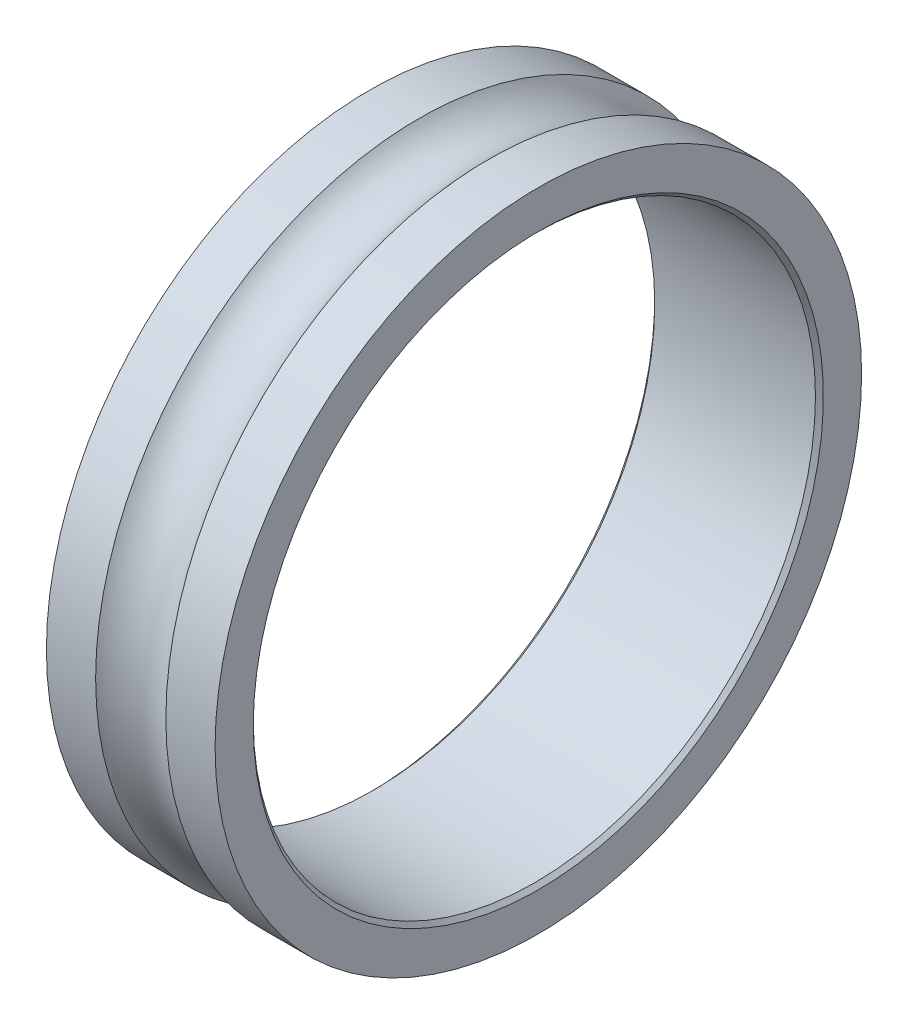
ISO-10303-21;
HEADER;
FILE_DESCRIPTION(('STEP AP214'),'2;1');
FILE_NAME('part.step','',(''),(''),'','','');
FILE_SCHEMA(('AUTOMOTIVE_DESIGN { 1 0 10303 214 1 1 1 1 }'));
ENDSEC;
DATA;
#1=APPLICATION_CONTEXT('core data for automotive mechanical design processes');
#2=APPLICATION_PROTOCOL_DEFINITION('international standard','automotive_design',2000,#1);
#3=PRODUCT_CONTEXT('',#1,'mechanical');
#4=PRODUCT('Part','Part','',(#3));
#5=PRODUCT_RELATED_PRODUCT_CATEGORY('part','',(#4));
#6=PRODUCT_DEFINITION_FORMATION('','',#4);
#7=PRODUCT_DEFINITION_CONTEXT('part definition',#1,'design');
#8=PRODUCT_DEFINITION('design','',#6,#7);
#9=PRODUCT_DEFINITION_SHAPE('','',#8);
#10=(LENGTH_UNIT() NAMED_UNIT(*) SI_UNIT(.MILLI.,.METRE.));
#11=(NAMED_UNIT(*) PLANE_ANGLE_UNIT() SI_UNIT($,.RADIAN.));
#12=(NAMED_UNIT(*) SI_UNIT($,.STERADIAN.) SOLID_ANGLE_UNIT());
#13=UNCERTAINTY_MEASURE_WITH_UNIT(LENGTH_MEASURE(1.E-05),#10,'distance_accuracy_value','');
#14=(GEOMETRIC_REPRESENTATION_CONTEXT(3) GLOBAL_UNCERTAINTY_ASSIGNED_CONTEXT((#13)) GLOBAL_UNIT_ASSIGNED_CONTEXT((#10,
#11,#12)) REPRESENTATION_CONTEXT('',''));
#15=CARTESIAN_POINT('',(0.,0.,0.));
#16=DIRECTION('',(0.,0.,1.));
#17=DIRECTION('',(1.,0.,0.));
#18=AXIS2_PLACEMENT_3D('',#15,#16,#17);
#19=CARTESIAN_POINT('',(0.,0.,0.));
#20=DIRECTION('',(-1.,0.,0.));
#21=DIRECTION('',(0.,0.,1.));
#22=AXIS2_PLACEMENT_3D('',#19,#20,#21);
#23=TOROIDAL_SURFACE('',#22,6.25,0.8);
#24=CARTESIAN_POINT('',(0.624499799839839,0.,0.));
#25=DIRECTION('',(-1.,0.,0.));
#26=DIRECTION('',(0.,0.,1.));
#27=AXIS2_PLACEMENT_3D('',#24,#25,#26);
#28=CIRCLE('',#27,5.75);
#29=CARTESIAN_POINT('',(0.624499799839839,0.,5.75));
#30=VERTEX_POINT('',#29);
#31=EDGE_CURVE('E65',#30,#30,#28,.T.);
#32=ORIENTED_EDGE('',*,*,#31,.T.);
#33=EDGE_LOOP('',(#32));
#34=FACE_BOUND('',#33,.T.);
#35=CARTESIAN_POINT('',(-0.62449979983984,0.,0.));
#36=DIRECTION('',(-1.,0.,0.));
#37=DIRECTION('',(0.,0.,1.));
#38=AXIS2_PLACEMENT_3D('',#35,#36,#37);
#39=CIRCLE('',#38,5.75);
#40=CARTESIAN_POINT('',(-0.62449979983984,0.,5.75));
#41=VERTEX_POINT('',#40);
#42=EDGE_CURVE('E10',#41,#41,#39,.T.);
#43=ORIENTED_EDGE('',*,*,#42,.F.);
#44=EDGE_LOOP('',(#43));
#45=FACE_BOUND('',#44,.T.);
#46=ADVANCED_FACE('F37',(#34,#45),#23,.F.);
#47=CARTESIAN_POINT('',(-1.5,0.,0.));
#48=DIRECTION('',(-1.,0.,0.));
#49=DIRECTION('',(0.,0.,1.));
#50=AXIS2_PLACEMENT_3D('',#47,#48,#49);
#51=CYLINDRICAL_SURFACE('',#50,5.75);
#52=CARTESIAN_POINT('',(-1.5,0.,0.));
#53=DIRECTION('',(-1.,0.,0.));
#54=DIRECTION('',(0.,0.,1.));
#55=AXIS2_PLACEMENT_3D('',#52,#53,#54);
#56=CIRCLE('',#55,5.75);
#57=CARTESIAN_POINT('',(-1.5,0.,5.75));
#58=VERTEX_POINT('',#57);
#59=EDGE_CURVE('E43',#58,#58,#56,.T.);
#60=ORIENTED_EDGE('',*,*,#59,.F.);
#61=EDGE_LOOP('',(#60));
#62=FACE_BOUND('',#61,.T.);
#63=ORIENTED_EDGE('',*,*,#42,.T.);
#64=EDGE_LOOP('',(#63));
#65=FACE_BOUND('',#64,.T.);
#66=ADVANCED_FACE('F103',(#62,#65),#51,.T.);
#67=CARTESIAN_POINT('',(-1.5,0.,0.));
#68=DIRECTION('',(-1.,0.,0.));
#69=DIRECTION('',(0.,0.,1.));
#70=AXIS2_PLACEMENT_3D('',#67,#68,#69);
#71=PLANE('',#70);
#72=ORIENTED_EDGE('',*,*,#59,.T.);
#73=EDGE_LOOP('',(#72));
#74=FACE_BOUND('',#73,.T.);
#75=CARTESIAN_POINT('',(-1.5,0.,0.));
#76=DIRECTION('',(-1.,0.,0.));
#77=DIRECTION('',(0.,0.,1.));
#78=AXIS2_PLACEMENT_3D('',#75,#76,#77);
#79=CIRCLE('',#78,5.07071067811865);
#80=CARTESIAN_POINT('',(-1.5,0.,5.07071067811865));
#81=VERTEX_POINT('',#80);
#82=EDGE_CURVE('E47',#81,#81,#79,.T.);
#83=ORIENTED_EDGE('',*,*,#82,.F.);
#84=EDGE_LOOP('',(#83));
#85=FACE_BOUND('',#84,.T.);
#86=ADVANCED_FACE('F97',(#74,#85),#71,.T.);
#87=CARTESIAN_POINT('',(-1.42928932188135,0.,0.));
#88=DIRECTION('',(-1.,0.,0.));
#89=DIRECTION('',(0.,0.,1.));
#90=AXIS2_PLACEMENT_3D('',#87,#88,#89);
#91=CONICAL_SURFACE('',#90,5.,0.785398163397447);
#92=ORIENTED_EDGE('',*,*,#82,.T.);
#93=EDGE_LOOP('',(#92));
#94=FACE_BOUND('',#93,.T.);
#95=CARTESIAN_POINT('',(-1.42928932188135,0.,0.));
#96=DIRECTION('',(-1.,0.,0.));
#97=DIRECTION('',(0.,0.,1.));
#98=AXIS2_PLACEMENT_3D('',#95,#96,#97);
#99=CIRCLE('',#98,5.);
#100=CARTESIAN_POINT('',(-1.42928932188135,0.,5.));
#101=VERTEX_POINT('',#100);
#102=EDGE_CURVE('E51',#101,#101,#99,.T.);
#103=ORIENTED_EDGE('',*,*,#102,.F.);
#104=EDGE_LOOP('',(#103));
#105=FACE_BOUND('',#104,.T.);
#106=ADVANCED_FACE('F92',(#94,#105),#91,.F.);
#107=CARTESIAN_POINT('',(-1.5,0.,0.));
#108=DIRECTION('',(-1.,0.,0.));
#109=DIRECTION('',(0.,0.,1.));
#110=AXIS2_PLACEMENT_3D('',#107,#108,#109);
#111=CYLINDRICAL_SURFACE('',#110,5.);
#112=CARTESIAN_POINT('',(1.42928932188135,0.,0.));
#113=DIRECTION('',(-1.,0.,0.));
#114=DIRECTION('',(0.,0.,1.));
#115=AXIS2_PLACEMENT_3D('',#112,#113,#114);
#116=CIRCLE('',#115,5.);
#117=CARTESIAN_POINT('',(1.42928932188135,0.,5.));
#118=VERTEX_POINT('',#117);
#119=EDGE_CURVE('E56',#118,#118,#116,.T.);
#120=ORIENTED_EDGE('',*,*,#119,.F.);
#121=EDGE_LOOP('',(#120));
#122=FACE_BOUND('',#121,.T.);
#123=ORIENTED_EDGE('',*,*,#102,.T.);
#124=EDGE_LOOP('',(#123));
#125=FACE_BOUND('',#124,.T.);
#126=ADVANCED_FACE('F86',(#122,#125),#111,.F.);
#127=CARTESIAN_POINT('',(1.42928932188135,0.,0.));
#128=DIRECTION('',(1.,0.,0.));
#129=DIRECTION('',(0.,0.,-1.));
#130=AXIS2_PLACEMENT_3D('',#127,#128,#129);
#131=CONICAL_SURFACE('',#130,5.,0.785398163397448);
#132=CARTESIAN_POINT('',(1.5,0.,0.));
#133=DIRECTION('',(-1.,0.,0.));
#134=DIRECTION('',(0.,0.,1.));
#135=AXIS2_PLACEMENT_3D('',#132,#133,#134);
#136=CIRCLE('',#135,5.07071067811865);
#137=CARTESIAN_POINT('',(1.5,0.,5.07071067811865));
#138=VERTEX_POINT('',#137);
#139=EDGE_CURVE('E59',#138,#138,#136,.T.);
#140=ORIENTED_EDGE('',*,*,#139,.F.);
#141=EDGE_LOOP('',(#140));
#142=FACE_BOUND('',#141,.T.);
#143=ORIENTED_EDGE('',*,*,#119,.T.);
#144=EDGE_LOOP('',(#143));
#145=FACE_BOUND('',#144,.T.);
#146=ADVANCED_FACE('F80',(#142,#145),#131,.F.);
#147=CARTESIAN_POINT('',(1.5,0.,0.));
#148=DIRECTION('',(-1.,0.,0.));
#149=DIRECTION('',(0.,0.,1.));
#150=AXIS2_PLACEMENT_3D('',#147,#148,#149);
#151=PLANE('',#150);
#152=CARTESIAN_POINT('',(1.5,0.,0.));
#153=DIRECTION('',(-1.,0.,0.));
#154=DIRECTION('',(0.,0.,1.));
#155=AXIS2_PLACEMENT_3D('',#152,#153,#154);
#156=CIRCLE('',#155,5.75);
#157=CARTESIAN_POINT('',(1.5,0.,5.75));
#158=VERTEX_POINT('',#157);
#159=EDGE_CURVE('E62',#158,#158,#156,.T.);
#160=ORIENTED_EDGE('',*,*,#159,.F.);
#161=EDGE_LOOP('',(#160));
#162=FACE_BOUND('',#161,.T.);
#163=ORIENTED_EDGE('',*,*,#139,.T.);
#164=EDGE_LOOP('',(#163));
#165=FACE_BOUND('',#164,.T.);
#166=ADVANCED_FACE('F74',(#162,#165),#151,.F.);
#167=CARTESIAN_POINT('',(-1.5,0.,0.));
#168=DIRECTION('',(-1.,0.,0.));
#169=DIRECTION('',(0.,0.,1.));
#170=AXIS2_PLACEMENT_3D('',#167,#168,#169);
#171=CYLINDRICAL_SURFACE('',#170,5.75);
#172=ORIENTED_EDGE('',*,*,#31,.F.);
#173=EDGE_LOOP('',(#172));
#174=FACE_BOUND('',#173,.T.);
#175=ORIENTED_EDGE('',*,*,#159,.T.);
#176=EDGE_LOOP('',(#175));
#177=FACE_BOUND('',#176,.T.);
#178=ADVANCED_FACE('F71',(#174,#177),#171,.T.);
#179=CLOSED_SHELL('',(#46,#66,#86,#106,#126,#146,#166,#178));
#180=MANIFOLD_SOLID_BREP('B2',#179);
#181=ADVANCED_BREP_SHAPE_REPRESENTATION('',(#18,#180),#14);
#182=SHAPE_DEFINITION_REPRESENTATION(#9,#181);
ENDSEC;
END-ISO-10303-21;
